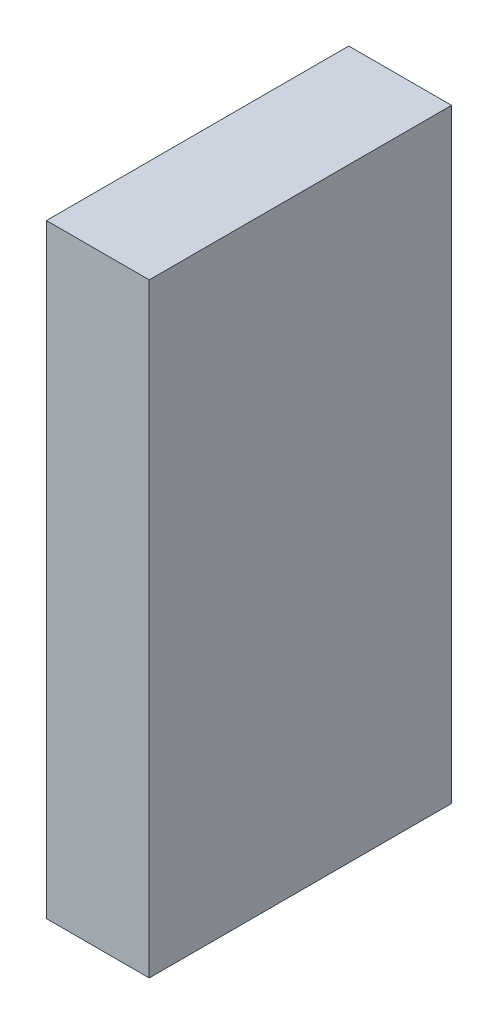
ISO-10303-21;
HEADER;
FILE_DESCRIPTION(('STEP AP214'),'2;1');
FILE_NAME('part.step','',(''),(''),'','','');
FILE_SCHEMA(('AUTOMOTIVE_DESIGN { 1 0 10303 214 1 1 1 1 }'));
ENDSEC;
DATA;
#1=APPLICATION_CONTEXT('core data for automotive mechanical design processes');
#2=APPLICATION_PROTOCOL_DEFINITION('international standard','automotive_design',2000,#1);
#3=PRODUCT_CONTEXT('',#1,'mechanical');
#4=PRODUCT('Part','Part','',(#3));
#5=PRODUCT_RELATED_PRODUCT_CATEGORY('part','',(#4));
#6=PRODUCT_DEFINITION_FORMATION('','',#4);
#7=PRODUCT_DEFINITION_CONTEXT('part definition',#1,'design');
#8=PRODUCT_DEFINITION('design','',#6,#7);
#9=PRODUCT_DEFINITION_SHAPE('','',#8);
#10=(LENGTH_UNIT() NAMED_UNIT(*) SI_UNIT(.MILLI.,.METRE.));
#11=(NAMED_UNIT(*) PLANE_ANGLE_UNIT() SI_UNIT($,.RADIAN.));
#12=(NAMED_UNIT(*) SI_UNIT($,.STERADIAN.) SOLID_ANGLE_UNIT());
#13=UNCERTAINTY_MEASURE_WITH_UNIT(LENGTH_MEASURE(1.E-05),#10,'distance_accuracy_value','');
#14=(GEOMETRIC_REPRESENTATION_CONTEXT(3) GLOBAL_UNCERTAINTY_ASSIGNED_CONTEXT((#13)) GLOBAL_UNIT_ASSIGNED_CONTEXT((#10,
#11,#12)) REPRESENTATION_CONTEXT('',''));
#15=CARTESIAN_POINT('',(0.,0.,0.));
#16=DIRECTION('',(0.,0.,1.));
#17=DIRECTION('',(1.,0.,0.));
#18=AXIS2_PLACEMENT_3D('',#15,#16,#17);
#19=CARTESIAN_POINT('',(-93.2376237623762,100.,-21.9059405940594));
#20=DIRECTION('',(1.,0.,0.));
#21=DIRECTION('',(0.,0.,-1.));
#22=AXIS2_PLACEMENT_3D('',#19,#20,#21);
#23=PLANE('',#22);
#24=DIRECTION('',(0.,0.,1.));
#25=VECTOR('',#24,1.);
#26=CARTESIAN_POINT('',(-93.2376237623762,0.,-21.9059405940594));
#27=LINE('',#26,#25);
#28=CARTESIAN_POINT('',(-93.2376237623762,0.,-21.9059405940594));
#29=VERTEX_POINT('',#28);
#30=CARTESIAN_POINT('',(-93.2376237623762,0.,28.0940594059406));
#31=VERTEX_POINT('',#30);
#32=EDGE_CURVE('E106',#29,#31,#27,.T.);
#33=ORIENTED_EDGE('',*,*,#32,.T.);
#34=DIRECTION('',(0.,-1.,0.));
#35=VECTOR('',#34,1.);
#36=CARTESIAN_POINT('',(-93.2376237623762,100.,28.0940594059406));
#37=LINE('',#36,#35);
#38=CARTESIAN_POINT('',(-93.2376237623762,100.,28.0940594059406));
#39=VERTEX_POINT('',#38);
#40=EDGE_CURVE('E11',#39,#31,#37,.T.);
#41=ORIENTED_EDGE('',*,*,#40,.F.);
#42=DIRECTION('',(0.,0.,1.));
#43=VECTOR('',#42,1.);
#44=CARTESIAN_POINT('',(-93.2376237623762,100.,-21.9059405940594));
#45=LINE('',#44,#43);
#46=CARTESIAN_POINT('',(-93.2376237623762,100.,-21.9059405940594));
#47=VERTEX_POINT('',#46);
#48=EDGE_CURVE('E94',#47,#39,#45,.T.);
#49=ORIENTED_EDGE('',*,*,#48,.F.);
#50=DIRECTION('',(0.,-1.,0.));
#51=VECTOR('',#50,1.);
#52=CARTESIAN_POINT('',(-93.2376237623762,100.,-21.9059405940594));
#53=LINE('',#52,#51);
#54=EDGE_CURVE('E102',#47,#29,#53,.T.);
#55=ORIENTED_EDGE('',*,*,#54,.T.);
#56=EDGE_LOOP('',(#33,#41,#49,#55));
#57=FACE_BOUND('',#56,.T.);
#58=ADVANCED_FACE('F43',(#57),#23,.F.);
#59=CARTESIAN_POINT('',(-93.2376237623762,100.,28.0940594059406));
#60=DIRECTION('',(0.,0.,-1.));
#61=DIRECTION('',(-1.,0.,0.));
#62=AXIS2_PLACEMENT_3D('',#59,#60,#61);
#63=PLANE('',#62);
#64=DIRECTION('',(1.,0.,0.));
#65=VECTOR('',#64,1.);
#66=CARTESIAN_POINT('',(-93.2376237623762,0.,28.0940594059406));
#67=LINE('',#66,#65);
#68=CARTESIAN_POINT('',(-76.2376237623762,0.,28.0940594059406));
#69=VERTEX_POINT('',#68);
#70=EDGE_CURVE('E98',#31,#69,#67,.T.);
#71=ORIENTED_EDGE('',*,*,#70,.T.);
#72=DIRECTION('',(0.,-1.,0.));
#73=VECTOR('',#72,1.);
#74=CARTESIAN_POINT('',(-76.2376237623762,100.,28.0940594059406));
#75=LINE('',#74,#73);
#76=CARTESIAN_POINT('',(-76.2376237623762,100.,28.0940594059406));
#77=VERTEX_POINT('',#76);
#78=EDGE_CURVE('E51',#77,#69,#75,.T.);
#79=ORIENTED_EDGE('',*,*,#78,.F.);
#80=DIRECTION('',(1.,0.,0.));
#81=VECTOR('',#80,1.);
#82=CARTESIAN_POINT('',(-93.2376237623762,100.,28.0940594059406));
#83=LINE('',#82,#81);
#84=EDGE_CURVE('E89',#39,#77,#83,.T.);
#85=ORIENTED_EDGE('',*,*,#84,.F.);
#86=ORIENTED_EDGE('',*,*,#40,.T.);
#87=EDGE_LOOP('',(#71,#79,#85,#86));
#88=FACE_BOUND('',#87,.T.);
#89=ADVANCED_FACE('F97',(#88),#63,.F.);
#90=CARTESIAN_POINT('',(-76.2376237623762,100.,-21.9059405940594));
#91=DIRECTION('',(-1.,0.,0.));
#92=DIRECTION('',(0.,0.,1.));
#93=AXIS2_PLACEMENT_3D('',#90,#91,#92);
#94=PLANE('',#93);
#95=DIRECTION('',(0.,0.,-1.));
#96=VECTOR('',#95,1.);
#97=CARTESIAN_POINT('',(-76.2376237623762,0.,-21.9059405940594));
#98=LINE('',#97,#96);
#99=CARTESIAN_POINT('',(-76.2376237623762,0.,-21.9059405940594));
#100=VERTEX_POINT('',#99);
#101=EDGE_CURVE('E76',#69,#100,#98,.T.);
#102=ORIENTED_EDGE('',*,*,#101,.T.);
#103=DIRECTION('',(0.,-1.,0.));
#104=VECTOR('',#103,1.);
#105=CARTESIAN_POINT('',(-76.2376237623762,100.,-21.9059405940594));
#106=LINE('',#105,#104);
#107=CARTESIAN_POINT('',(-76.2376237623762,100.,-21.9059405940594));
#108=VERTEX_POINT('',#107);
#109=EDGE_CURVE('E99',#108,#100,#106,.T.);
#110=ORIENTED_EDGE('',*,*,#109,.F.);
#111=DIRECTION('',(0.,0.,-1.));
#112=VECTOR('',#111,1.);
#113=CARTESIAN_POINT('',(-76.2376237623762,100.,-21.9059405940594));
#114=LINE('',#113,#112);
#115=EDGE_CURVE('E92',#77,#108,#114,.T.);
#116=ORIENTED_EDGE('',*,*,#115,.F.);
#117=ORIENTED_EDGE('',*,*,#78,.T.);
#118=EDGE_LOOP('',(#102,#110,#116,#117));
#119=FACE_BOUND('',#118,.T.);
#120=ADVANCED_FACE('F100',(#119),#94,.F.);
#121=CARTESIAN_POINT('',(-93.2376237623762,100.,-21.9059405940594));
#122=DIRECTION('',(0.,0.,1.));
#123=DIRECTION('',(1.,0.,0.));
#124=AXIS2_PLACEMENT_3D('',#121,#122,#123);
#125=PLANE('',#124);
#126=DIRECTION('',(-1.,0.,0.));
#127=VECTOR('',#126,1.);
#128=CARTESIAN_POINT('',(-93.2376237623762,0.,-21.9059405940594));
#129=LINE('',#128,#127);
#130=EDGE_CURVE('E82',#100,#29,#129,.T.);
#131=ORIENTED_EDGE('',*,*,#130,.T.);
#132=ORIENTED_EDGE('',*,*,#54,.F.);
#133=DIRECTION('',(-1.,0.,0.));
#134=VECTOR('',#133,1.);
#135=CARTESIAN_POINT('',(-93.2376237623762,100.,-21.9059405940594));
#136=LINE('',#135,#134);
#137=EDGE_CURVE('E59',#108,#47,#136,.T.);
#138=ORIENTED_EDGE('',*,*,#137,.F.);
#139=ORIENTED_EDGE('',*,*,#109,.T.);
#140=EDGE_LOOP('',(#131,#132,#138,#139));
#141=FACE_BOUND('',#140,.T.);
#142=ADVANCED_FACE('F113',(#141),#125,.F.);
#143=CARTESIAN_POINT('',(0.,100.,0.));
#144=DIRECTION('',(0.,1.,0.));
#145=DIRECTION('',(0.,0.,1.));
#146=AXIS2_PLACEMENT_3D('',#143,#144,#145);
#147=PLANE('',#146);
#148=ORIENTED_EDGE('',*,*,#48,.T.);
#149=ORIENTED_EDGE('',*,*,#84,.T.);
#150=ORIENTED_EDGE('',*,*,#115,.T.);
#151=ORIENTED_EDGE('',*,*,#137,.T.);
#152=EDGE_LOOP('',(#148,#149,#150,#151));
#153=FACE_BOUND('',#152,.T.);
#154=ADVANCED_FACE('F90',(#153),#147,.T.);
#155=CARTESIAN_POINT('',(0.,0.,0.));
#156=DIRECTION('',(0.,1.,0.));
#157=DIRECTION('',(0.,0.,1.));
#158=AXIS2_PLACEMENT_3D('',#155,#156,#157);
#159=PLANE('',#158);
#160=ORIENTED_EDGE('',*,*,#32,.F.);
#161=ORIENTED_EDGE('',*,*,#130,.F.);
#162=ORIENTED_EDGE('',*,*,#101,.F.);
#163=ORIENTED_EDGE('',*,*,#70,.F.);
#164=EDGE_LOOP('',(#160,#161,#162,#163));
#165=FACE_BOUND('',#164,.T.);
#166=ADVANCED_FACE('F116',(#165),#159,.F.);
#167=CLOSED_SHELL('',(#58,#89,#120,#142,#154,#166));
#168=MANIFOLD_SOLID_BREP('B2',#167);
#169=ADVANCED_BREP_SHAPE_REPRESENTATION('',(#18,#168),#14);
#170=SHAPE_DEFINITION_REPRESENTATION(#9,#169);
ENDSEC;
END-ISO-10303-21;
